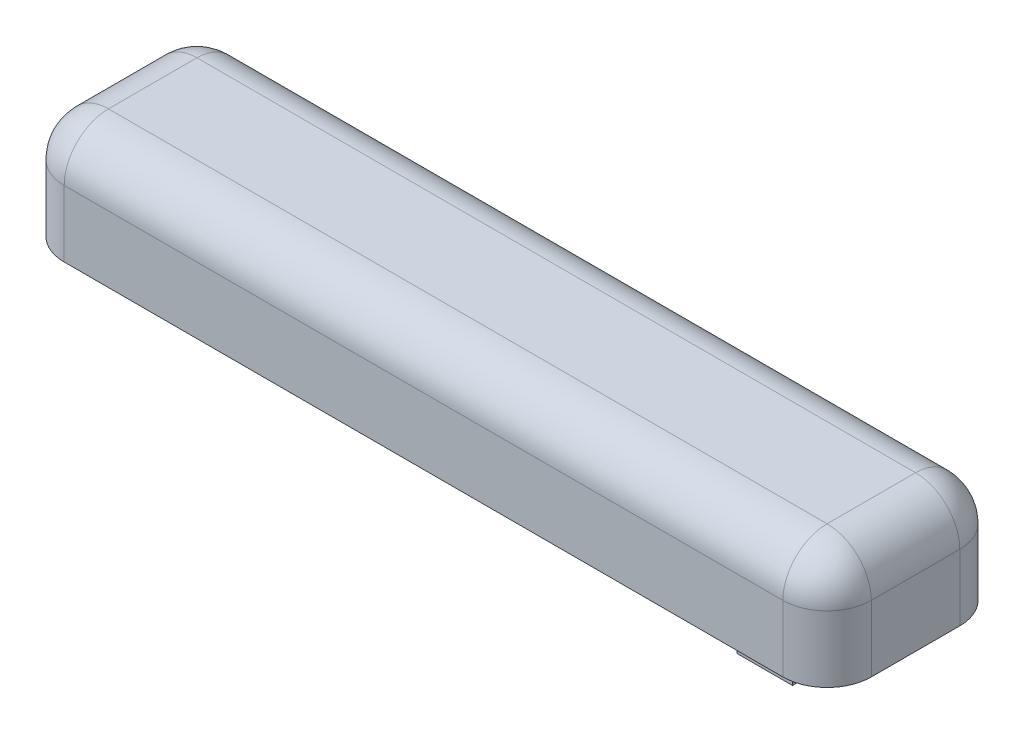
ISO-10303-21;
HEADER;
FILE_DESCRIPTION(('STEP AP214'),'2;1');
FILE_NAME('part.step','',(''),(''),'','','');
FILE_SCHEMA(('AUTOMOTIVE_DESIGN { 1 0 10303 214 1 1 1 1 }'));
ENDSEC;
DATA;
#1=APPLICATION_CONTEXT('core data for automotive mechanical design processes');
#2=APPLICATION_PROTOCOL_DEFINITION('international standard','automotive_design',2000,#1);
#3=PRODUCT_CONTEXT('',#1,'mechanical');
#4=PRODUCT('Part','Part','',(#3));
#5=PRODUCT_RELATED_PRODUCT_CATEGORY('part','',(#4));
#6=PRODUCT_DEFINITION_FORMATION('','',#4);
#7=PRODUCT_DEFINITION_CONTEXT('part definition',#1,'design');
#8=PRODUCT_DEFINITION('design','',#6,#7);
#9=PRODUCT_DEFINITION_SHAPE('','',#8);
#10=(LENGTH_UNIT() NAMED_UNIT(*) SI_UNIT(.MILLI.,.METRE.));
#11=(NAMED_UNIT(*) PLANE_ANGLE_UNIT() SI_UNIT($,.RADIAN.));
#12=(NAMED_UNIT(*) SI_UNIT($,.STERADIAN.) SOLID_ANGLE_UNIT());
#13=UNCERTAINTY_MEASURE_WITH_UNIT(LENGTH_MEASURE(1.E-05),#10,'distance_accuracy_value','');
#14=(GEOMETRIC_REPRESENTATION_CONTEXT(3) GLOBAL_UNCERTAINTY_ASSIGNED_CONTEXT((#13)) GLOBAL_UNIT_ASSIGNED_CONTEXT((#10,
#11,#12)) REPRESENTATION_CONTEXT('',''));
#15=CARTESIAN_POINT('',(0.,0.,0.));
#16=DIRECTION('',(0.,0.,1.));
#17=DIRECTION('',(1.,0.,0.));
#18=AXIS2_PLACEMENT_3D('',#15,#16,#17);
#19=CARTESIAN_POINT('',(0.,0.,0.));
#20=DIRECTION('',(0.,-1.,0.));
#21=DIRECTION('',(0.,0.,-1.));
#22=AXIS2_PLACEMENT_3D('',#19,#20,#21);
#23=PLANE('',#22);
#24=DIRECTION('',(-1.,0.,0.));
#25=VECTOR('',#24,1.);
#26=CARTESIAN_POINT('',(0.,0.,0.));
#27=LINE('',#26,#25);
#28=CARTESIAN_POINT('',(-20.,0.,0.));
#29=VERTEX_POINT('',#28);
#30=CARTESIAN_POINT('',(-345.,0.,0.));
#31=VERTEX_POINT('',#30);
#32=EDGE_CURVE('E276',#29,#31,#27,.T.);
#33=ORIENTED_EDGE('',*,*,#32,.T.);
#34=CARTESIAN_POINT('',(-345.,0.,-20.));
#35=DIRECTION('',(0.,-1.,0.));
#36=DIRECTION('',(0.,0.,-1.));
#37=AXIS2_PLACEMENT_3D('',#34,#35,#36);
#38=CIRCLE('',#37,20.);
#39=CARTESIAN_POINT('',(-365.,0.,-20.));
#40=VERTEX_POINT('',#39);
#41=EDGE_CURVE('E353',#31,#40,#38,.T.);
#42=ORIENTED_EDGE('',*,*,#41,.T.);
#43=DIRECTION('',(0.,0.,-1.));
#44=VECTOR('',#43,1.);
#45=CARTESIAN_POINT('',(-365.,0.,0.));
#46=LINE('',#45,#44);
#47=CARTESIAN_POINT('',(-365.,0.,-60.));
#48=VERTEX_POINT('',#47);
#49=EDGE_CURVE('E271',#40,#48,#46,.T.);
#50=ORIENTED_EDGE('',*,*,#49,.T.);
#51=CARTESIAN_POINT('',(-345.,0.,-60.));
#52=DIRECTION('',(0.,-1.,0.));
#53=DIRECTION('',(0.,0.,-1.));
#54=AXIS2_PLACEMENT_3D('',#51,#52,#53);
#55=CIRCLE('',#54,20.);
#56=CARTESIAN_POINT('',(-345.,0.,-80.));
#57=VERTEX_POINT('',#56);
#58=EDGE_CURVE('E350',#48,#57,#55,.T.);
#59=ORIENTED_EDGE('',*,*,#58,.T.);
#60=DIRECTION('',(-1.,0.,0.));
#61=VECTOR('',#60,1.);
#62=CARTESIAN_POINT('',(0.,0.,-80.));
#63=LINE('',#62,#61);
#64=CARTESIAN_POINT('',(-20.,0.,-80.));
#65=VERTEX_POINT('',#64);
#66=EDGE_CURVE('E267',#65,#57,#63,.T.);
#67=ORIENTED_EDGE('',*,*,#66,.F.);
#68=CARTESIAN_POINT('',(-20.,0.,-60.));
#69=DIRECTION('',(0.,-1.,0.));
#70=DIRECTION('',(0.,0.,-1.));
#71=AXIS2_PLACEMENT_3D('',#68,#69,#70);
#72=CIRCLE('',#71,20.);
#73=CARTESIAN_POINT('',(0.,0.,-60.));
#74=VERTEX_POINT('',#73);
#75=EDGE_CURVE('E308',#65,#74,#72,.T.);
#76=ORIENTED_EDGE('',*,*,#75,.T.);
#77=DIRECTION('',(0.,0.,-1.));
#78=VECTOR('',#77,1.);
#79=CARTESIAN_POINT('',(0.,0.,0.));
#80=LINE('',#79,#78);
#81=CARTESIAN_POINT('',(0.,0.,-20.));
#82=VERTEX_POINT('',#81);
#83=EDGE_CURVE('E280',#82,#74,#80,.T.);
#84=ORIENTED_EDGE('',*,*,#83,.F.);
#85=CARTESIAN_POINT('',(-20.,0.,-20.));
#86=DIRECTION('',(0.,-1.,0.));
#87=DIRECTION('',(0.,0.,-1.));
#88=AXIS2_PLACEMENT_3D('',#85,#86,#87);
#89=CIRCLE('',#88,20.);
#90=EDGE_CURVE('E311',#82,#29,#89,.T.);
#91=ORIENTED_EDGE('',*,*,#90,.T.);
#92=EDGE_LOOP('',(#33,#42,#50,#59,#67,#76,#84,#91));
#93=FACE_BOUND('',#92,.T.);
#94=DIRECTION('',(1.,0.,0.));
#95=VECTOR('',#94,1.);
#96=CARTESIAN_POINT('',(-66.4671931853962,0.,-50.816617584412));
#97=LINE('',#96,#95);
#98=CARTESIAN_POINT('',(-66.4671931853962,0.,-50.816617584412));
#99=VERTEX_POINT('',#98);
#100=CARTESIAN_POINT('',(-41.4671931853962,0.,-50.816617584412));
#101=VERTEX_POINT('',#100);
#102=EDGE_CURVE('E246',#99,#101,#97,.T.);
#103=ORIENTED_EDGE('',*,*,#102,.F.);
#104=DIRECTION('',(0.,0.,-1.));
#105=VECTOR('',#104,1.);
#106=CARTESIAN_POINT('',(-66.4671931853962,0.,-25.816617584412));
#107=LINE('',#106,#105);
#108=CARTESIAN_POINT('',(-66.4671931853962,0.,-25.816617584412));
#109=VERTEX_POINT('',#108);
#110=EDGE_CURVE('E222',#109,#99,#107,.T.);
#111=ORIENTED_EDGE('',*,*,#110,.F.);
#112=DIRECTION('',(-1.,0.,0.));
#113=VECTOR('',#112,1.);
#114=CARTESIAN_POINT('',(-66.4671931853962,0.,-25.816617584412));
#115=LINE('',#114,#113);
#116=CARTESIAN_POINT('',(-41.4671931853962,0.,-25.816617584412));
#117=VERTEX_POINT('',#116);
#118=EDGE_CURVE('E233',#117,#109,#115,.T.);
#119=ORIENTED_EDGE('',*,*,#118,.F.);
#120=DIRECTION('',(0.,0.,1.));
#121=VECTOR('',#120,1.);
#122=CARTESIAN_POINT('',(-41.4671931853962,0.,-25.816617584412));
#123=LINE('',#122,#121);
#124=EDGE_CURVE('E249',#101,#117,#123,.T.);
#125=ORIENTED_EDGE('',*,*,#124,.F.);
#126=EDGE_LOOP('',(#103,#111,#119,#125));
#127=FACE_BOUND('',#126,.T.);
#128=ADVANCED_FACE('F49',(#93,#127),#23,.T.);
#129=CARTESIAN_POINT('',(0.,50.,-80.));
#130=DIRECTION('',(0.,0.,1.));
#131=DIRECTION('',(1.,0.,0.));
#132=AXIS2_PLACEMENT_3D('',#129,#130,#131);
#133=PLANE('',#132);
#134=ORIENTED_EDGE('',*,*,#66,.T.);
#135=DIRECTION('',(0.,-1.,0.));
#136=VECTOR('',#135,1.);
#137=CARTESIAN_POINT('',(-345.,30.,-80.));
#138=LINE('',#137,#136);
#139=CARTESIAN_POINT('',(-345.,30.,-80.));
#140=VERTEX_POINT('',#139);
#141=EDGE_CURVE('E368',#57,#140,#138,.F.);
#142=ORIENTED_EDGE('',*,*,#141,.T.);
#143=DIRECTION('',(-1.,0.,0.));
#144=VECTOR('',#143,1.);
#145=CARTESIAN_POINT('',(0.,30.,-80.));
#146=LINE('',#145,#144);
#147=CARTESIAN_POINT('',(-20.,30.,-80.));
#148=VERTEX_POINT('',#147);
#149=EDGE_CURVE('E288',#140,#148,#146,.F.);
#150=ORIENTED_EDGE('',*,*,#149,.T.);
#151=DIRECTION('',(0.,-1.,0.));
#152=VECTOR('',#151,1.);
#153=CARTESIAN_POINT('',(-20.,50.,-80.));
#154=LINE('',#153,#152);
#155=EDGE_CURVE('E321',#148,#65,#154,.T.);
#156=ORIENTED_EDGE('',*,*,#155,.T.);
#157=EDGE_LOOP('',(#134,#142,#150,#156));
#158=FACE_BOUND('',#157,.T.);
#159=ADVANCED_FACE('F452',(#158),#133,.F.);
#160=CARTESIAN_POINT('',(-365.,50.,0.));
#161=DIRECTION('',(-1.,0.,0.));
#162=DIRECTION('',(0.,0.,1.));
#163=AXIS2_PLACEMENT_3D('',#160,#161,#162);
#164=PLANE('',#163);
#165=ORIENTED_EDGE('',*,*,#49,.F.);
#166=DIRECTION('',(0.,-1.,0.));
#167=VECTOR('',#166,1.);
#168=CARTESIAN_POINT('',(-365.,50.,-20.));
#169=LINE('',#168,#167);
#170=CARTESIAN_POINT('',(-365.,30.,-20.));
#171=VERTEX_POINT('',#170);
#172=EDGE_CURVE('E362',#40,#171,#169,.F.);
#173=ORIENTED_EDGE('',*,*,#172,.T.);
#174=DIRECTION('',(0.,0.,-1.));
#175=VECTOR('',#174,1.);
#176=CARTESIAN_POINT('',(-365.,30.,-60.));
#177=LINE('',#176,#175);
#178=CARTESIAN_POINT('',(-365.,30.,-60.));
#179=VERTEX_POINT('',#178);
#180=EDGE_CURVE('E356',#171,#179,#177,.T.);
#181=ORIENTED_EDGE('',*,*,#180,.T.);
#182=DIRECTION('',(0.,-1.,0.));
#183=VECTOR('',#182,1.);
#184=CARTESIAN_POINT('',(-365.,0.,-60.));
#185=LINE('',#184,#183);
#186=EDGE_CURVE('E359',#179,#48,#185,.T.);
#187=ORIENTED_EDGE('',*,*,#186,.T.);
#188=EDGE_LOOP('',(#165,#173,#181,#187));
#189=FACE_BOUND('',#188,.T.);
#190=ADVANCED_FACE('F398',(#189),#164,.T.);
#191=CARTESIAN_POINT('',(0.,50.,0.));
#192=DIRECTION('',(0.,0.,1.));
#193=DIRECTION('',(1.,0.,0.));
#194=AXIS2_PLACEMENT_3D('',#191,#192,#193);
#195=PLANE('',#194);
#196=DIRECTION('',(-1.,0.,0.));
#197=VECTOR('',#196,1.);
#198=CARTESIAN_POINT('',(-365.,30.,0.));
#199=LINE('',#198,#197);
#200=CARTESIAN_POINT('',(-20.,30.,0.));
#201=VERTEX_POINT('',#200);
#202=CARTESIAN_POINT('',(-345.,30.,0.));
#203=VERTEX_POINT('',#202);
#204=EDGE_CURVE('E291',#201,#203,#199,.T.);
#205=ORIENTED_EDGE('',*,*,#204,.T.);
#206=DIRECTION('',(0.,-1.,0.));
#207=VECTOR('',#206,1.);
#208=CARTESIAN_POINT('',(-345.,50.,0.));
#209=LINE('',#208,#207);
#210=EDGE_CURVE('E331',#203,#31,#209,.T.);
#211=ORIENTED_EDGE('',*,*,#210,.T.);
#212=ORIENTED_EDGE('',*,*,#32,.F.);
#213=DIRECTION('',(0.,-1.,0.));
#214=VECTOR('',#213,1.);
#215=CARTESIAN_POINT('',(-20.,30.,0.));
#216=LINE('',#215,#214);
#217=EDGE_CURVE('E314',#29,#201,#216,.F.);
#218=ORIENTED_EDGE('',*,*,#217,.T.);
#219=EDGE_LOOP('',(#205,#211,#212,#218));
#220=FACE_BOUND('',#219,.T.);
#221=ADVANCED_FACE('F408',(#220),#195,.T.);
#222=CARTESIAN_POINT('',(0.,50.,0.));
#223=DIRECTION('',(-1.,0.,0.));
#224=DIRECTION('',(0.,0.,1.));
#225=AXIS2_PLACEMENT_3D('',#222,#223,#224);
#226=PLANE('',#225);
#227=DIRECTION('',(0.,0.,-1.));
#228=VECTOR('',#227,1.);
#229=CARTESIAN_POINT('',(0.,30.,0.));
#230=LINE('',#229,#228);
#231=CARTESIAN_POINT('',(0.,30.,-60.));
#232=VERTEX_POINT('',#231);
#233=CARTESIAN_POINT('',(0.,30.,-20.));
#234=VERTEX_POINT('',#233);
#235=EDGE_CURVE('E298',#232,#234,#230,.F.);
#236=ORIENTED_EDGE('',*,*,#235,.T.);
#237=DIRECTION('',(0.,-1.,0.));
#238=VECTOR('',#237,1.);
#239=CARTESIAN_POINT('',(0.,0.,-20.));
#240=LINE('',#239,#238);
#241=EDGE_CURVE('E304',#234,#82,#240,.T.);
#242=ORIENTED_EDGE('',*,*,#241,.T.);
#243=ORIENTED_EDGE('',*,*,#83,.T.);
#244=DIRECTION('',(0.,-1.,0.));
#245=VECTOR('',#244,1.);
#246=CARTESIAN_POINT('',(0.,50.,-60.));
#247=LINE('',#246,#245);
#248=EDGE_CURVE('E301',#74,#232,#247,.F.);
#249=ORIENTED_EDGE('',*,*,#248,.T.);
#250=EDGE_LOOP('',(#236,#242,#243,#249));
#251=FACE_BOUND('',#250,.T.);
#252=ADVANCED_FACE('F438',(#251),#226,.F.);
#253=CARTESIAN_POINT('',(0.,50.,0.));
#254=DIRECTION('',(0.,-1.,0.));
#255=DIRECTION('',(0.,0.,-1.));
#256=AXIS2_PLACEMENT_3D('',#253,#254,#255);
#257=PLANE('',#256);
#258=DIRECTION('',(-1.,0.,0.));
#259=VECTOR('',#258,1.);
#260=CARTESIAN_POINT('',(0.,50.,-60.));
#261=LINE('',#260,#259);
#262=CARTESIAN_POINT('',(-20.,50.,-60.));
#263=VERTEX_POINT('',#262);
#264=CARTESIAN_POINT('',(-345.,50.,-60.));
#265=VERTEX_POINT('',#264);
#266=EDGE_CURVE('E284',#263,#265,#261,.T.);
#267=ORIENTED_EDGE('',*,*,#266,.T.);
#268=DIRECTION('',(0.,0.,-1.));
#269=VECTOR('',#268,1.);
#270=CARTESIAN_POINT('',(-345.,50.,-20.));
#271=LINE('',#270,#269);
#272=CARTESIAN_POINT('',(-345.,50.,-20.));
#273=VERTEX_POINT('',#272);
#274=EDGE_CURVE('E11',#265,#273,#271,.F.);
#275=ORIENTED_EDGE('',*,*,#274,.T.);
#276=DIRECTION('',(-1.,0.,0.));
#277=VECTOR('',#276,1.);
#278=CARTESIAN_POINT('',(0.,50.,-20.));
#279=LINE('',#278,#277);
#280=CARTESIAN_POINT('',(-20.,50.,-20.));
#281=VERTEX_POINT('',#280);
#282=EDGE_CURVE('E295',#273,#281,#279,.F.);
#283=ORIENTED_EDGE('',*,*,#282,.T.);
#284=DIRECTION('',(0.,0.,-1.));
#285=VECTOR('',#284,1.);
#286=CARTESIAN_POINT('',(-20.,50.,0.));
#287=LINE('',#286,#285);
#288=EDGE_CURVE('E328',#281,#263,#287,.T.);
#289=ORIENTED_EDGE('',*,*,#288,.T.);
#290=EDGE_LOOP('',(#267,#275,#283,#289));
#291=FACE_BOUND('',#290,.T.);
#292=ADVANCED_FACE('F421',(#291),#257,.F.);
#293=CARTESIAN_POINT('',(0.,30.,-60.));
#294=DIRECTION('',(-1.,0.,0.));
#295=DIRECTION('',(0.,0.,1.));
#296=AXIS2_PLACEMENT_3D('',#293,#294,#295);
#297=CYLINDRICAL_SURFACE('',#296,20.);
#298=ORIENTED_EDGE('',*,*,#149,.F.);
#299=CARTESIAN_POINT('',(-345.,30.,-60.));
#300=DIRECTION('',(-1.,0.,0.));
#301=DIRECTION('',(0.,0.,1.));
#302=AXIS2_PLACEMENT_3D('',#299,#300,#301);
#303=CIRCLE('',#302,20.);
#304=EDGE_CURVE('E59',#140,#265,#303,.F.);
#305=ORIENTED_EDGE('',*,*,#304,.T.);
#306=ORIENTED_EDGE('',*,*,#266,.F.);
#307=CARTESIAN_POINT('',(-20.,30.,-60.));
#308=DIRECTION('',(-1.,0.,0.));
#309=DIRECTION('',(0.,0.,1.));
#310=AXIS2_PLACEMENT_3D('',#307,#308,#309);
#311=CIRCLE('',#310,20.);
#312=EDGE_CURVE('E324',#263,#148,#311,.T.);
#313=ORIENTED_EDGE('',*,*,#312,.T.);
#314=EDGE_LOOP('',(#298,#305,#306,#313));
#315=FACE_BOUND('',#314,.T.);
#316=ADVANCED_FACE('F450',(#315),#297,.T.);
#317=CARTESIAN_POINT('',(0.,30.,-20.));
#318=DIRECTION('',(1.,0.,0.));
#319=DIRECTION('',(0.,0.,-1.));
#320=AXIS2_PLACEMENT_3D('',#317,#318,#319);
#321=CYLINDRICAL_SURFACE('',#320,20.);
#322=ORIENTED_EDGE('',*,*,#282,.F.);
#323=CARTESIAN_POINT('',(-345.,30.,-20.));
#324=DIRECTION('',(1.,0.,0.));
#325=DIRECTION('',(0.,0.,-1.));
#326=AXIS2_PLACEMENT_3D('',#323,#324,#325);
#327=CIRCLE('',#326,20.);
#328=EDGE_CURVE('E365',#273,#203,#327,.T.);
#329=ORIENTED_EDGE('',*,*,#328,.T.);
#330=ORIENTED_EDGE('',*,*,#204,.F.);
#331=CARTESIAN_POINT('',(-20.,30.,-20.));
#332=DIRECTION('',(1.,0.,0.));
#333=DIRECTION('',(0.,0.,-1.));
#334=AXIS2_PLACEMENT_3D('',#331,#332,#333);
#335=CIRCLE('',#334,20.);
#336=EDGE_CURVE('E317',#201,#281,#335,.F.);
#337=ORIENTED_EDGE('',*,*,#336,.T.);
#338=EDGE_LOOP('',(#322,#329,#330,#337));
#339=FACE_BOUND('',#338,.T.);
#340=ADVANCED_FACE('F423',(#339),#321,.T.);
#341=CARTESIAN_POINT('',(-20.,50.,-60.));
#342=DIRECTION('',(0.,-1.,0.));
#343=DIRECTION('',(0.,0.,-1.));
#344=AXIS2_PLACEMENT_3D('',#341,#342,#343);
#345=CYLINDRICAL_SURFACE('',#344,20.);
#346=ORIENTED_EDGE('',*,*,#75,.F.);
#347=ORIENTED_EDGE('',*,*,#155,.F.);
#348=CARTESIAN_POINT('',(-20.,30.,-60.));
#349=DIRECTION('',(0.,1.,0.));
#350=DIRECTION('',(0.,0.,1.));
#351=AXIS2_PLACEMENT_3D('',#348,#349,#350);
#352=CIRCLE('',#351,20.);
#353=EDGE_CURVE('E272',#232,#148,#352,.T.);
#354=ORIENTED_EDGE('',*,*,#353,.F.);
#355=ORIENTED_EDGE('',*,*,#248,.F.);
#356=EDGE_LOOP('',(#346,#347,#354,#355));
#357=FACE_BOUND('',#356,.T.);
#358=ADVANCED_FACE('F443',(#357),#345,.T.);
#359=CARTESIAN_POINT('',(-20.,30.,-60.));
#360=DIRECTION('',(-1.,0.,0.));
#361=DIRECTION('',(0.,0.,1.));
#362=AXIS2_PLACEMENT_3D('',#359,#360,#361);
#363=SPHERICAL_SURFACE('',#362,20.);
#364=ORIENTED_EDGE('',*,*,#353,.T.);
#365=ORIENTED_EDGE('',*,*,#312,.F.);
#366=CARTESIAN_POINT('',(-20.,30.,-60.));
#367=DIRECTION('',(0.,0.,1.));
#368=DIRECTION('',(1.,0.,0.));
#369=AXIS2_PLACEMENT_3D('',#366,#367,#368);
#370=CIRCLE('',#369,20.);
#371=EDGE_CURVE('E340',#232,#263,#370,.T.);
#372=ORIENTED_EDGE('',*,*,#371,.F.);
#373=EDGE_LOOP('',(#364,#365,#372));
#374=FACE_BOUND('',#373,.T.);
#375=ADVANCED_FACE('F447',(#374),#363,.T.);
#376=CARTESIAN_POINT('',(-20.,30.,0.));
#377=DIRECTION('',(0.,0.,-1.));
#378=DIRECTION('',(-1.,0.,0.));
#379=AXIS2_PLACEMENT_3D('',#376,#377,#378);
#380=CYLINDRICAL_SURFACE('',#379,20.);
#381=ORIENTED_EDGE('',*,*,#371,.T.);
#382=ORIENTED_EDGE('',*,*,#288,.F.);
#383=CARTESIAN_POINT('',(-20.,30.,-20.));
#384=DIRECTION('',(0.,0.,1.));
#385=DIRECTION('',(1.,0.,0.));
#386=AXIS2_PLACEMENT_3D('',#383,#384,#385);
#387=CIRCLE('',#386,20.);
#388=EDGE_CURVE('E336',#234,#281,#387,.T.);
#389=ORIENTED_EDGE('',*,*,#388,.F.);
#390=ORIENTED_EDGE('',*,*,#235,.F.);
#391=EDGE_LOOP('',(#381,#382,#389,#390));
#392=FACE_BOUND('',#391,.T.);
#393=ADVANCED_FACE('F429',(#392),#380,.T.);
#394=CARTESIAN_POINT('',(-20.,30.,-20.));
#395=DIRECTION('',(-1.,0.,0.));
#396=DIRECTION('',(0.,0.,1.));
#397=AXIS2_PLACEMENT_3D('',#394,#395,#396);
#398=SPHERICAL_SURFACE('',#397,20.);
#399=ORIENTED_EDGE('',*,*,#388,.T.);
#400=ORIENTED_EDGE('',*,*,#336,.F.);
#401=CARTESIAN_POINT('',(-20.,30.,-20.));
#402=DIRECTION('',(0.,-1.,0.));
#403=DIRECTION('',(0.,0.,-1.));
#404=AXIS2_PLACEMENT_3D('',#401,#402,#403);
#405=CIRCLE('',#404,20.);
#406=EDGE_CURVE('E332',#234,#201,#405,.T.);
#407=ORIENTED_EDGE('',*,*,#406,.F.);
#408=EDGE_LOOP('',(#399,#400,#407));
#409=FACE_BOUND('',#408,.T.);
#410=ADVANCED_FACE('F432',(#409),#398,.T.);
#411=CARTESIAN_POINT('',(-20.,50.,-20.));
#412=DIRECTION('',(0.,1.,0.));
#413=DIRECTION('',(0.,0.,1.));
#414=AXIS2_PLACEMENT_3D('',#411,#412,#413);
#415=CYLINDRICAL_SURFACE('',#414,20.);
#416=ORIENTED_EDGE('',*,*,#406,.T.);
#417=ORIENTED_EDGE('',*,*,#217,.F.);
#418=ORIENTED_EDGE('',*,*,#90,.F.);
#419=ORIENTED_EDGE('',*,*,#241,.F.);
#420=EDGE_LOOP('',(#416,#417,#418,#419));
#421=FACE_BOUND('',#420,.T.);
#422=ADVANCED_FACE('F435',(#421),#415,.T.);
#423=CARTESIAN_POINT('',(-345.,50.,-60.));
#424=DIRECTION('',(0.,1.,0.));
#425=DIRECTION('',(0.,0.,1.));
#426=AXIS2_PLACEMENT_3D('',#423,#424,#425);
#427=CYLINDRICAL_SURFACE('',#426,20.);
#428=CARTESIAN_POINT('',(-345.,30.,-60.));
#429=DIRECTION('',(0.,1.,0.));
#430=DIRECTION('',(0.,0.,1.));
#431=AXIS2_PLACEMENT_3D('',#428,#429,#430);
#432=CIRCLE('',#431,20.);
#433=EDGE_CURVE('E53',#140,#179,#432,.T.);
#434=ORIENTED_EDGE('',*,*,#433,.F.);
#435=ORIENTED_EDGE('',*,*,#141,.F.);
#436=ORIENTED_EDGE('',*,*,#58,.F.);
#437=ORIENTED_EDGE('',*,*,#186,.F.);
#438=EDGE_LOOP('',(#434,#435,#436,#437));
#439=FACE_BOUND('',#438,.T.);
#440=ADVANCED_FACE('F51',(#439),#427,.T.);
#441=CARTESIAN_POINT('',(-345.,30.,-60.));
#442=DIRECTION('',(-1.,0.,0.));
#443=DIRECTION('',(0.,0.,1.));
#444=AXIS2_PLACEMENT_3D('',#441,#442,#443);
#445=SPHERICAL_SURFACE('',#444,20.);
#446=ORIENTED_EDGE('',*,*,#304,.F.);
#447=ORIENTED_EDGE('',*,*,#433,.T.);
#448=CARTESIAN_POINT('',(-345.,30.,-60.));
#449=DIRECTION('',(0.,0.,1.));
#450=DIRECTION('',(1.,0.,0.));
#451=AXIS2_PLACEMENT_3D('',#448,#449,#450);
#452=CIRCLE('',#451,20.);
#453=EDGE_CURVE('E379',#265,#179,#452,.T.);
#454=ORIENTED_EDGE('',*,*,#453,.F.);
#455=EDGE_LOOP('',(#446,#447,#454));
#456=FACE_BOUND('',#455,.T.);
#457=ADVANCED_FACE('F391',(#456),#445,.T.);
#458=CARTESIAN_POINT('',(-345.,30.,0.));
#459=DIRECTION('',(0.,0.,1.));
#460=DIRECTION('',(1.,0.,0.));
#461=AXIS2_PLACEMENT_3D('',#458,#459,#460);
#462=CYLINDRICAL_SURFACE('',#461,20.);
#463=CARTESIAN_POINT('',(-345.,30.,-20.));
#464=DIRECTION('',(0.,0.,1.));
#465=DIRECTION('',(1.,0.,0.));
#466=AXIS2_PLACEMENT_3D('',#463,#464,#465);
#467=CIRCLE('',#466,20.);
#468=EDGE_CURVE('E376',#273,#171,#467,.T.);
#469=ORIENTED_EDGE('',*,*,#468,.F.);
#470=ORIENTED_EDGE('',*,*,#274,.F.);
#471=ORIENTED_EDGE('',*,*,#453,.T.);
#472=ORIENTED_EDGE('',*,*,#180,.F.);
#473=EDGE_LOOP('',(#469,#470,#471,#472));
#474=FACE_BOUND('',#473,.T.);
#475=ADVANCED_FACE('F418',(#474),#462,.T.);
#476=CARTESIAN_POINT('',(-345.,30.,-20.));
#477=DIRECTION('',(-1.,0.,0.));
#478=DIRECTION('',(0.,0.,1.));
#479=AXIS2_PLACEMENT_3D('',#476,#477,#478);
#480=SPHERICAL_SURFACE('',#479,20.);
#481=ORIENTED_EDGE('',*,*,#328,.F.);
#482=ORIENTED_EDGE('',*,*,#468,.T.);
#483=CARTESIAN_POINT('',(-345.,30.,-20.));
#484=DIRECTION('',(0.,-1.,0.));
#485=DIRECTION('',(0.,0.,-1.));
#486=AXIS2_PLACEMENT_3D('',#483,#484,#485);
#487=CIRCLE('',#486,20.);
#488=EDGE_CURVE('E266',#203,#171,#487,.T.);
#489=ORIENTED_EDGE('',*,*,#488,.F.);
#490=EDGE_LOOP('',(#481,#482,#489));
#491=FACE_BOUND('',#490,.T.);
#492=ADVANCED_FACE('F416',(#491),#480,.T.);
#493=CARTESIAN_POINT('',(-345.,50.,-20.));
#494=DIRECTION('',(0.,-1.,0.));
#495=DIRECTION('',(0.,0.,-1.));
#496=AXIS2_PLACEMENT_3D('',#493,#494,#495);
#497=CYLINDRICAL_SURFACE('',#496,20.);
#498=ORIENTED_EDGE('',*,*,#488,.T.);
#499=ORIENTED_EDGE('',*,*,#172,.F.);
#500=ORIENTED_EDGE('',*,*,#41,.F.);
#501=ORIENTED_EDGE('',*,*,#210,.F.);
#502=EDGE_LOOP('',(#498,#499,#500,#501));
#503=FACE_BOUND('',#502,.T.);
#504=ADVANCED_FACE('F406',(#503),#497,.T.);
#505=CARTESIAN_POINT('',(-66.4671931853962,-27.,-25.816617584412));
#506=DIRECTION('',(1.,0.,0.));
#507=DIRECTION('',(0.,0.,-1.));
#508=AXIS2_PLACEMENT_3D('',#505,#506,#507);
#509=PLANE('',#508);
#510=ORIENTED_EDGE('',*,*,#110,.T.);
#511=DIRECTION('',(0.,1.,0.));
#512=VECTOR('',#511,1.);
#513=CARTESIAN_POINT('',(-66.4671931853962,-27.,-50.816617584412));
#514=LINE('',#513,#512);
#515=CARTESIAN_POINT('',(-66.4671931853962,-27.,-50.816617584412));
#516=VERTEX_POINT('',#515);
#517=EDGE_CURVE('E263',#516,#99,#514,.T.);
#518=ORIENTED_EDGE('',*,*,#517,.F.);
#519=DIRECTION('',(0.,0.,-1.));
#520=VECTOR('',#519,1.);
#521=CARTESIAN_POINT('',(-66.4671931853962,-27.,-25.816617584412));
#522=LINE('',#521,#520);
#523=CARTESIAN_POINT('',(-66.4671931853962,-27.,-25.816617584412));
#524=VERTEX_POINT('',#523);
#525=EDGE_CURVE('E228',#524,#516,#522,.T.);
#526=ORIENTED_EDGE('',*,*,#525,.F.);
#527=DIRECTION('',(0.,1.,0.));
#528=VECTOR('',#527,1.);
#529=CARTESIAN_POINT('',(-66.4671931853962,-27.,-25.816617584412));
#530=LINE('',#529,#528);
#531=EDGE_CURVE('E242',#524,#109,#530,.T.);
#532=ORIENTED_EDGE('',*,*,#531,.T.);
#533=EDGE_LOOP('',(#510,#518,#526,#532));
#534=FACE_BOUND('',#533,.T.);
#535=ADVANCED_FACE('F479',(#534),#509,.F.);
#536=CARTESIAN_POINT('',(-66.4671931853962,-27.,-50.816617584412));
#537=DIRECTION('',(0.,0.,1.));
#538=DIRECTION('',(1.,0.,0.));
#539=AXIS2_PLACEMENT_3D('',#536,#537,#538);
#540=PLANE('',#539);
#541=ORIENTED_EDGE('',*,*,#102,.T.);
#542=DIRECTION('',(0.,1.,0.));
#543=VECTOR('',#542,1.);
#544=CARTESIAN_POINT('',(-41.4671931853962,-27.,-50.816617584412));
#545=LINE('',#544,#543);
#546=CARTESIAN_POINT('',(-41.4671931853962,-27.,-50.816617584412));
#547=VERTEX_POINT('',#546);
#548=EDGE_CURVE('E259',#547,#101,#545,.T.);
#549=ORIENTED_EDGE('',*,*,#548,.F.);
#550=DIRECTION('',(1.,0.,0.));
#551=VECTOR('',#550,1.);
#552=CARTESIAN_POINT('',(-66.4671931853962,-27.,-50.816617584412));
#553=LINE('',#552,#551);
#554=EDGE_CURVE('E232',#516,#547,#553,.T.);
#555=ORIENTED_EDGE('',*,*,#554,.F.);
#556=ORIENTED_EDGE('',*,*,#517,.T.);
#557=EDGE_LOOP('',(#541,#549,#555,#556));
#558=FACE_BOUND('',#557,.T.);
#559=ADVANCED_FACE('F600',(#558),#540,.F.);
#560=CARTESIAN_POINT('',(-41.4671931853962,-27.,-25.816617584412));
#561=DIRECTION('',(-1.,0.,0.));
#562=DIRECTION('',(0.,0.,1.));
#563=AXIS2_PLACEMENT_3D('',#560,#561,#562);
#564=PLANE('',#563);
#565=ORIENTED_EDGE('',*,*,#124,.T.);
#566=DIRECTION('',(0.,1.,0.));
#567=VECTOR('',#566,1.);
#568=CARTESIAN_POINT('',(-41.4671931853962,-27.,-25.816617584412));
#569=LINE('',#568,#567);
#570=CARTESIAN_POINT('',(-41.4671931853962,-27.,-25.816617584412));
#571=VERTEX_POINT('',#570);
#572=EDGE_CURVE('E75',#571,#117,#569,.T.);
#573=ORIENTED_EDGE('',*,*,#572,.F.);
#574=DIRECTION('',(0.,0.,1.));
#575=VECTOR('',#574,1.);
#576=CARTESIAN_POINT('',(-41.4671931853962,-27.,-25.816617584412));
#577=LINE('',#576,#575);
#578=EDGE_CURVE('E236',#547,#571,#577,.T.);
#579=ORIENTED_EDGE('',*,*,#578,.F.);
#580=ORIENTED_EDGE('',*,*,#548,.T.);
#581=EDGE_LOOP('',(#565,#573,#579,#580));
#582=FACE_BOUND('',#581,.T.);
#583=ADVANCED_FACE('F609',(#582),#564,.F.);
#584=CARTESIAN_POINT('',(-66.4671931853962,-27.,-25.816617584412));
#585=DIRECTION('',(0.,0.,-1.));
#586=DIRECTION('',(-1.,0.,0.));
#587=AXIS2_PLACEMENT_3D('',#584,#585,#586);
#588=PLANE('',#587);
#589=ORIENTED_EDGE('',*,*,#118,.T.);
#590=ORIENTED_EDGE('',*,*,#531,.F.);
#591=DIRECTION('',(-1.,0.,0.));
#592=VECTOR('',#591,1.);
#593=CARTESIAN_POINT('',(-66.4671931853962,-27.,-25.816617584412));
#594=LINE('',#593,#592);
#595=EDGE_CURVE('E239',#571,#524,#594,.T.);
#596=ORIENTED_EDGE('',*,*,#595,.F.);
#597=ORIENTED_EDGE('',*,*,#572,.T.);
#598=EDGE_LOOP('',(#589,#590,#596,#597));
#599=FACE_BOUND('',#598,.T.);
#600=ADVANCED_FACE('F618',(#599),#588,.F.);
#601=CARTESIAN_POINT('',(0.,-27.,0.));
#602=DIRECTION('',(0.,-1.,0.));
#603=DIRECTION('',(0.,0.,-1.));
#604=AXIS2_PLACEMENT_3D('',#601,#602,#603);
#605=PLANE('',#604);
#606=DIRECTION('',(0.,0.,1.));
#607=VECTOR('',#606,1.);
#608=CARTESIAN_POINT('',(-44.5,-27.,-47.5));
#609=LINE('',#608,#607);
#610=CARTESIAN_POINT('',(-44.5,-27.,-47.5));
#611=VERTEX_POINT('',#610);
#612=CARTESIAN_POINT('',(-44.5,-27.,-28.5));
#613=VERTEX_POINT('',#612);
#614=EDGE_CURVE('E67',#611,#613,#609,.T.);
#615=ORIENTED_EDGE('',*,*,#614,.F.);
#616=DIRECTION('',(1.,0.,0.));
#617=VECTOR('',#616,1.);
#618=CARTESIAN_POINT('',(-63.5,-27.,-47.5));
#619=LINE('',#618,#617);
#620=CARTESIAN_POINT('',(-63.5,-27.,-47.5));
#621=VERTEX_POINT('',#620);
#622=EDGE_CURVE('E200',#621,#611,#619,.T.);
#623=ORIENTED_EDGE('',*,*,#622,.F.);
#624=DIRECTION('',(0.,0.,-1.));
#625=VECTOR('',#624,1.);
#626=CARTESIAN_POINT('',(-63.5,-27.,-47.5));
#627=LINE('',#626,#625);
#628=CARTESIAN_POINT('',(-63.5,-27.,-28.5));
#629=VERTEX_POINT('',#628);
#630=EDGE_CURVE('E204',#629,#621,#627,.T.);
#631=ORIENTED_EDGE('',*,*,#630,.F.);
#632=DIRECTION('',(-1.,0.,0.));
#633=VECTOR('',#632,1.);
#634=CARTESIAN_POINT('',(-63.5,-27.,-28.5));
#635=LINE('',#634,#633);
#636=EDGE_CURVE('E213',#613,#629,#635,.T.);
#637=ORIENTED_EDGE('',*,*,#636,.F.);
#638=EDGE_LOOP('',(#615,#623,#631,#637));
#639=FACE_BOUND('',#638,.T.);
#640=ORIENTED_EDGE('',*,*,#525,.T.);
#641=ORIENTED_EDGE('',*,*,#554,.T.);
#642=ORIENTED_EDGE('',*,*,#578,.T.);
#643=ORIENTED_EDGE('',*,*,#595,.T.);
#644=EDGE_LOOP('',(#640,#641,#642,#643));
#645=FACE_BOUND('',#644,.T.);
#646=ADVANCED_FACE('F627',(#639,#645),#605,.T.);
#647=CARTESIAN_POINT('',(-44.5,-4.,-47.5));
#648=DIRECTION('',(1.,0.,0.));
#649=DIRECTION('',(0.,0.,-1.));
#650=AXIS2_PLACEMENT_3D('',#647,#648,#649);
#651=PLANE('',#650);
#652=ORIENTED_EDGE('',*,*,#614,.T.);
#653=DIRECTION('',(0.,-1.,0.));
#654=VECTOR('',#653,1.);
#655=CARTESIAN_POINT('',(-44.5,-4.,-28.5));
#656=LINE('',#655,#654);
#657=CARTESIAN_POINT('',(-44.5,-4.,-28.5));
#658=VERTEX_POINT('',#657);
#659=EDGE_CURVE('E175',#658,#613,#656,.T.);
#660=ORIENTED_EDGE('',*,*,#659,.F.);
#661=DIRECTION('',(0.,0.,1.));
#662=VECTOR('',#661,1.);
#663=CARTESIAN_POINT('',(-44.5,-4.,-47.5));
#664=LINE('',#663,#662);
#665=CARTESIAN_POINT('',(-44.5,-4.,-47.5));
#666=VERTEX_POINT('',#665);
#667=EDGE_CURVE('E179',#666,#658,#664,.T.);
#668=ORIENTED_EDGE('',*,*,#667,.F.);
#669=DIRECTION('',(0.,-1.,0.));
#670=VECTOR('',#669,1.);
#671=CARTESIAN_POINT('',(-44.5,-4.,-47.5));
#672=LINE('',#671,#670);
#673=EDGE_CURVE('E219',#666,#611,#672,.T.);
#674=ORIENTED_EDGE('',*,*,#673,.T.);
#675=EDGE_LOOP('',(#652,#660,#668,#674));
#676=FACE_BOUND('',#675,.T.);
#677=ADVANCED_FACE('F177',(#676),#651,.F.);
#678=CARTESIAN_POINT('',(-63.5,-4.,-47.5));
#679=DIRECTION('',(0.,0.,-1.));
#680=DIRECTION('',(-1.,0.,0.));
#681=AXIS2_PLACEMENT_3D('',#678,#679,#680);
#682=PLANE('',#681);
#683=ORIENTED_EDGE('',*,*,#622,.T.);
#684=ORIENTED_EDGE('',*,*,#673,.F.);
#685=DIRECTION('',(1.,0.,0.));
#686=VECTOR('',#685,1.);
#687=CARTESIAN_POINT('',(-63.5,-4.,-47.5));
#688=LINE('',#687,#686);
#689=CARTESIAN_POINT('',(-63.5,-4.,-47.5));
#690=VERTEX_POINT('',#689);
#691=EDGE_CURVE('E186',#690,#666,#688,.T.);
#692=ORIENTED_EDGE('',*,*,#691,.F.);
#693=DIRECTION('',(0.,-1.,0.));
#694=VECTOR('',#693,1.);
#695=CARTESIAN_POINT('',(-63.5,-4.,-47.5));
#696=LINE('',#695,#694);
#697=EDGE_CURVE('E223',#690,#621,#696,.T.);
#698=ORIENTED_EDGE('',*,*,#697,.T.);
#699=EDGE_LOOP('',(#683,#684,#692,#698));
#700=FACE_BOUND('',#699,.T.);
#701=ADVANCED_FACE('F643',(#700),#682,.F.);
#702=CARTESIAN_POINT('',(-63.5,-4.,-47.5));
#703=DIRECTION('',(-1.,0.,0.));
#704=DIRECTION('',(0.,0.,1.));
#705=AXIS2_PLACEMENT_3D('',#702,#703,#704);
#706=PLANE('',#705);
#707=ORIENTED_EDGE('',*,*,#630,.T.);
#708=ORIENTED_EDGE('',*,*,#697,.F.);
#709=DIRECTION('',(0.,0.,-1.));
#710=VECTOR('',#709,1.);
#711=CARTESIAN_POINT('',(-63.5,-4.,-47.5));
#712=LINE('',#711,#710);
#713=CARTESIAN_POINT('',(-63.5,-4.,-28.5));
#714=VERTEX_POINT('',#713);
#715=EDGE_CURVE('E195',#714,#690,#712,.T.);
#716=ORIENTED_EDGE('',*,*,#715,.F.);
#717=DIRECTION('',(0.,-1.,0.));
#718=VECTOR('',#717,1.);
#719=CARTESIAN_POINT('',(-63.5,-4.,-28.5));
#720=LINE('',#719,#718);
#721=EDGE_CURVE('E185',#714,#629,#720,.T.);
#722=ORIENTED_EDGE('',*,*,#721,.T.);
#723=EDGE_LOOP('',(#707,#708,#716,#722));
#724=FACE_BOUND('',#723,.T.);
#725=ADVANCED_FACE('F651',(#724),#706,.F.);
#726=CARTESIAN_POINT('',(-63.5,-4.,-28.5));
#727=DIRECTION('',(0.,0.,1.));
#728=DIRECTION('',(1.,0.,0.));
#729=AXIS2_PLACEMENT_3D('',#726,#727,#728);
#730=PLANE('',#729);
#731=ORIENTED_EDGE('',*,*,#636,.T.);
#732=ORIENTED_EDGE('',*,*,#721,.F.);
#733=DIRECTION('',(-1.,0.,0.));
#734=VECTOR('',#733,1.);
#735=CARTESIAN_POINT('',(-63.5,-4.,-28.5));
#736=LINE('',#735,#734);
#737=EDGE_CURVE('E189',#658,#714,#736,.T.);
#738=ORIENTED_EDGE('',*,*,#737,.F.);
#739=ORIENTED_EDGE('',*,*,#659,.T.);
#740=EDGE_LOOP('',(#731,#732,#738,#739));
#741=FACE_BOUND('',#740,.T.);
#742=ADVANCED_FACE('F190',(#741),#730,.F.);
#743=CARTESIAN_POINT('',(0.,-4.,0.));
#744=DIRECTION('',(0.,1.,0.));
#745=DIRECTION('',(0.,0.,1.));
#746=AXIS2_PLACEMENT_3D('',#743,#744,#745);
#747=PLANE('',#746);
#748=ORIENTED_EDGE('',*,*,#667,.T.);
#749=ORIENTED_EDGE('',*,*,#737,.T.);
#750=ORIENTED_EDGE('',*,*,#715,.T.);
#751=ORIENTED_EDGE('',*,*,#691,.T.);
#752=EDGE_LOOP('',(#748,#749,#750,#751));
#753=FACE_BOUND('',#752,.T.);
#754=ADVANCED_FACE('F197',(#753),#747,.F.);
#755=CLOSED_SHELL('',(#128,#159,#190,#221,#252,#292,#316,#340,#358,#375,#393,#410,#422,#440,
#457,#475,#492,#504,#535,#559,#583,#600,#646,#677,#701,#725,#742,#754));
#756=MANIFOLD_SOLID_BREP('B2',#755);
#757=ADVANCED_BREP_SHAPE_REPRESENTATION('',(#18,#756),#14);
#758=SHAPE_DEFINITION_REPRESENTATION(#9,#757);
ENDSEC;
END-ISO-10303-21;
